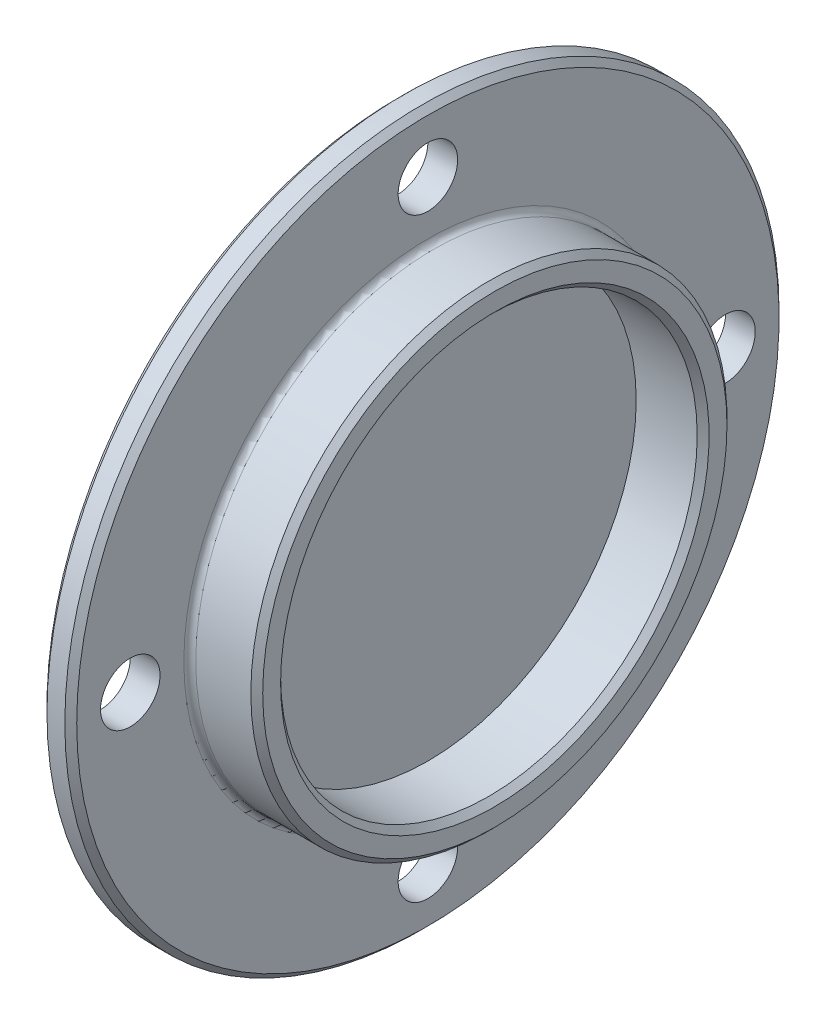
ISO-10303-21;
HEADER;
FILE_DESCRIPTION(('STEP AP214'),'2;1');
FILE_NAME('part.step','',(''),(''),'','','');
FILE_SCHEMA(('AUTOMOTIVE_DESIGN { 1 0 10303 214 1 1 1 1 }'));
ENDSEC;
DATA;
#1=APPLICATION_CONTEXT('core data for automotive mechanical design processes');
#2=APPLICATION_PROTOCOL_DEFINITION('international standard','automotive_design',2000,#1);
#3=PRODUCT_CONTEXT('',#1,'mechanical');
#4=PRODUCT('Part','Part','',(#3));
#5=PRODUCT_RELATED_PRODUCT_CATEGORY('part','',(#4));
#6=PRODUCT_DEFINITION_FORMATION('','',#4);
#7=PRODUCT_DEFINITION_CONTEXT('part definition',#1,'design');
#8=PRODUCT_DEFINITION('design','',#6,#7);
#9=PRODUCT_DEFINITION_SHAPE('','',#8);
#10=(LENGTH_UNIT() NAMED_UNIT(*) SI_UNIT(.MILLI.,.METRE.));
#11=(NAMED_UNIT(*) PLANE_ANGLE_UNIT() SI_UNIT($,.RADIAN.));
#12=(NAMED_UNIT(*) SI_UNIT($,.STERADIAN.) SOLID_ANGLE_UNIT());
#13=UNCERTAINTY_MEASURE_WITH_UNIT(LENGTH_MEASURE(1.E-05),#10,'distance_accuracy_value','');
#14=(GEOMETRIC_REPRESENTATION_CONTEXT(3) GLOBAL_UNCERTAINTY_ASSIGNED_CONTEXT((#13)) GLOBAL_UNIT_ASSIGNED_CONTEXT((#10,
#11,#12)) REPRESENTATION_CONTEXT('',''));
#15=CARTESIAN_POINT('',(0.,0.,0.));
#16=DIRECTION('',(0.,0.,1.));
#17=DIRECTION('',(1.,0.,0.));
#18=AXIS2_PLACEMENT_3D('',#15,#16,#17);
#19=CARTESIAN_POINT('',(0.,120.,0.));
#20=DIRECTION('',(1.,0.,0.));
#21=DIRECTION('',(0.,0.,-1.));
#22=AXIS2_PLACEMENT_3D('',#19,#20,#21);
#23=PLANE('',#22);
#24=CARTESIAN_POINT('',(0.,0.,0.));
#25=DIRECTION('',(1.,0.,0.));
#26=DIRECTION('',(0.,0.,-1.));
#27=AXIS2_PLACEMENT_3D('',#24,#25,#26);
#28=CIRCLE('',#27,118.);
#29=CARTESIAN_POINT('',(0.,0.,-118.));
#30=VERTEX_POINT('',#29);
#31=EDGE_CURVE('E80',#30,#30,#28,.F.);
#32=ORIENTED_EDGE('',*,*,#31,.T.);
#33=EDGE_LOOP('',(#32));
#34=FACE_BOUND('',#33,.T.);
#35=CARTESIAN_POINT('',(0.,0.,-100.));
#36=DIRECTION('',(1.,0.,0.));
#37=DIRECTION('',(0.,0.,-1.));
#38=AXIS2_PLACEMENT_3D('',#35,#36,#37);
#39=CIRCLE('',#38,9.99999999999999);
#40=CARTESIAN_POINT('',(0.,0.,-110.));
#41=VERTEX_POINT('',#40);
#42=EDGE_CURVE('E109',#41,#41,#39,.T.);
#43=ORIENTED_EDGE('',*,*,#42,.T.);
#44=EDGE_LOOP('',(#43));
#45=FACE_BOUND('',#44,.T.);
#46=CARTESIAN_POINT('',(0.,-100.,3.49148133884313E-13));
#47=DIRECTION('',(1.,0.,0.));
#48=DIRECTION('',(0.,0.,-1.));
#49=AXIS2_PLACEMENT_3D('',#46,#47,#48);
#50=CIRCLE('',#49,10.);
#51=CARTESIAN_POINT('',(0.,-100.,-9.99999999999965));
#52=VERTEX_POINT('',#51);
#53=EDGE_CURVE('E121',#52,#52,#50,.T.);
#54=ORIENTED_EDGE('',*,*,#53,.T.);
#55=EDGE_LOOP('',(#54));
#56=FACE_BOUND('',#55,.T.);
#57=CARTESIAN_POINT('',(0.,6.98296267768627E-13,100.));
#58=DIRECTION('',(1.,0.,0.));
#59=DIRECTION('',(0.,0.,-1.));
#60=AXIS2_PLACEMENT_3D('',#57,#58,#59);
#61=CIRCLE('',#60,9.99999999999999);
#62=CARTESIAN_POINT('',(0.,6.98296267768627E-13,90.));
#63=VERTEX_POINT('',#62);
#64=EDGE_CURVE('E117',#63,#63,#61,.T.);
#65=ORIENTED_EDGE('',*,*,#64,.T.);
#66=EDGE_LOOP('',(#65));
#67=FACE_BOUND('',#66,.T.);
#68=CARTESIAN_POINT('',(0.,100.,-1.04744440165294E-12));
#69=DIRECTION('',(1.,0.,0.));
#70=DIRECTION('',(0.,0.,-1.));
#71=AXIS2_PLACEMENT_3D('',#68,#69,#70);
#72=CIRCLE('',#71,9.99999999999999);
#73=CARTESIAN_POINT('',(0.,100.,-10.000000000001));
#74=VERTEX_POINT('',#73);
#75=EDGE_CURVE('E113',#74,#74,#72,.T.);
#76=ORIENTED_EDGE('',*,*,#75,.T.);
#77=EDGE_LOOP('',(#76));
#78=FACE_BOUND('',#77,.T.);
#79=ADVANCED_FACE('F43',(#34,#45,#56,#67,#78),#23,.F.);
#80=CARTESIAN_POINT('',(10.,0.,0.));
#81=DIRECTION('',(-1.,0.,0.));
#82=DIRECTION('',(0.,0.,1.));
#83=AXIS2_PLACEMENT_3D('',#80,#81,#82);
#84=PLANE('',#83);
#85=CARTESIAN_POINT('',(10.,0.,0.));
#86=DIRECTION('',(-1.,0.,0.));
#87=DIRECTION('',(0.,0.,1.));
#88=AXIS2_PLACEMENT_3D('',#85,#86,#87);
#89=CIRCLE('',#88,70.);
#90=CARTESIAN_POINT('',(10.,0.,70.));
#91=VERTEX_POINT('',#90);
#92=EDGE_CURVE('E92',#91,#91,#89,.T.);
#93=ORIENTED_EDGE('',*,*,#92,.F.);
#94=EDGE_LOOP('',(#93));
#95=FACE_BOUND('',#94,.T.);
#96=ADVANCED_FACE('F167',(#95),#84,.F.);
#97=CARTESIAN_POINT('',(-39.7802197802198,0.,0.));
#98=DIRECTION('',(-1.,0.,0.));
#99=DIRECTION('',(0.,0.,1.));
#100=AXIS2_PLACEMENT_3D('',#97,#98,#99);
#101=CYLINDRICAL_SURFACE('',#100,70.);
#102=CARTESIAN_POINT('',(30.5,0.,0.));
#103=DIRECTION('',(-1.,0.,0.));
#104=DIRECTION('',(0.,0.,1.));
#105=AXIS2_PLACEMENT_3D('',#102,#103,#104);
#106=CIRCLE('',#105,70.);
#107=CARTESIAN_POINT('',(30.5,0.,70.));
#108=VERTEX_POINT('',#107);
#109=EDGE_CURVE('E52',#108,#108,#106,.F.);
#110=ORIENTED_EDGE('',*,*,#109,.T.);
#111=EDGE_LOOP('',(#110));
#112=FACE_BOUND('',#111,.T.);
#113=ORIENTED_EDGE('',*,*,#92,.T.);
#114=EDGE_LOOP('',(#113));
#115=FACE_BOUND('',#114,.T.);
#116=ADVANCED_FACE('F173',(#112,#115),#101,.F.);
#117=CARTESIAN_POINT('',(32.5,70.,0.));
#118=DIRECTION('',(-1.,0.,0.));
#119=DIRECTION('',(0.,0.,1.));
#120=AXIS2_PLACEMENT_3D('',#117,#118,#119);
#121=PLANE('',#120);
#122=CARTESIAN_POINT('',(32.5,0.,0.));
#123=DIRECTION('',(-1.,0.,0.));
#124=DIRECTION('',(0.,0.,1.));
#125=AXIS2_PLACEMENT_3D('',#122,#123,#124);
#126=CIRCLE('',#125,72.);
#127=CARTESIAN_POINT('',(32.5,0.,72.));
#128=VERTEX_POINT('',#127);
#129=EDGE_CURVE('E57',#128,#128,#126,.T.);
#130=ORIENTED_EDGE('',*,*,#129,.T.);
#131=EDGE_LOOP('',(#130));
#132=FACE_BOUND('',#131,.T.);
#133=CARTESIAN_POINT('',(32.5,0.,0.));
#134=DIRECTION('',(-1.,0.,0.));
#135=DIRECTION('',(0.,0.,1.));
#136=AXIS2_PLACEMENT_3D('',#133,#134,#135);
#137=CIRCLE('',#136,78.);
#138=CARTESIAN_POINT('',(32.5,0.,78.));
#139=VERTEX_POINT('',#138);
#140=EDGE_CURVE('E62',#139,#139,#137,.F.);
#141=ORIENTED_EDGE('',*,*,#140,.T.);
#142=EDGE_LOOP('',(#141));
#143=FACE_BOUND('',#142,.T.);
#144=ADVANCED_FACE('F207',(#132,#143),#121,.F.);
#145=CARTESIAN_POINT('',(-39.7802197802198,0.,0.));
#146=DIRECTION('',(-1.,0.,0.));
#147=DIRECTION('',(0.,0.,1.));
#148=AXIS2_PLACEMENT_3D('',#145,#146,#147);
#149=CYLINDRICAL_SURFACE('',#148,80.);
#150=CARTESIAN_POINT('',(30.5,0.,0.));
#151=DIRECTION('',(-1.,0.,0.));
#152=DIRECTION('',(0.,0.,1.));
#153=AXIS2_PLACEMENT_3D('',#150,#151,#152);
#154=CIRCLE('',#153,80.);
#155=CARTESIAN_POINT('',(30.5,0.,80.));
#156=VERTEX_POINT('',#155);
#157=EDGE_CURVE('E10',#156,#156,#154,.T.);
#158=ORIENTED_EDGE('',*,*,#157,.T.);
#159=EDGE_LOOP('',(#158));
#160=FACE_BOUND('',#159,.T.);
#161=CARTESIAN_POINT('',(12.,0.,0.));
#162=DIRECTION('',(-1.,0.,0.));
#163=DIRECTION('',(0.,0.,1.));
#164=AXIS2_PLACEMENT_3D('',#161,#162,#163);
#165=CIRCLE('',#164,80.);
#166=CARTESIAN_POINT('',(12.,0.,80.));
#167=VERTEX_POINT('',#166);
#168=EDGE_CURVE('E84',#167,#167,#165,.F.);
#169=ORIENTED_EDGE('',*,*,#168,.T.);
#170=EDGE_LOOP('',(#169));
#171=FACE_BOUND('',#170,.T.);
#172=ADVANCED_FACE('F143',(#160,#171),#149,.T.);
#173=CARTESIAN_POINT('',(9.99999999999999,80.,0.));
#174=DIRECTION('',(-1.,0.,0.));
#175=DIRECTION('',(0.,0.,1.));
#176=AXIS2_PLACEMENT_3D('',#173,#174,#175);
#177=PLANE('',#176);
#178=CARTESIAN_POINT('',(9.99999999999999,0.,0.));
#179=DIRECTION('',(-1.,0.,0.));
#180=DIRECTION('',(0.,0.,1.));
#181=AXIS2_PLACEMENT_3D('',#178,#179,#180);
#182=CIRCLE('',#181,118.);
#183=CARTESIAN_POINT('',(9.99999999999999,0.,118.));
#184=VERTEX_POINT('',#183);
#185=EDGE_CURVE('E68',#184,#184,#182,.F.);
#186=ORIENTED_EDGE('',*,*,#185,.T.);
#187=EDGE_LOOP('',(#186));
#188=FACE_BOUND('',#187,.T.);
#189=CARTESIAN_POINT('',(9.99999999999999,0.,0.));
#190=DIRECTION('',(-1.,0.,0.));
#191=DIRECTION('',(0.,0.,1.));
#192=AXIS2_PLACEMENT_3D('',#189,#190,#191);
#193=CIRCLE('',#192,82.);
#194=CARTESIAN_POINT('',(9.99999999999999,0.,82.));
#195=VERTEX_POINT('',#194);
#196=EDGE_CURVE('E88',#195,#195,#193,.T.);
#197=ORIENTED_EDGE('',*,*,#196,.T.);
#198=EDGE_LOOP('',(#197));
#199=FACE_BOUND('',#198,.T.);
#200=CARTESIAN_POINT('',(9.99999999999999,0.,-100.));
#201=DIRECTION('',(-1.,0.,0.));
#202=DIRECTION('',(0.,0.,1.));
#203=AXIS2_PLACEMENT_3D('',#200,#201,#202);
#204=CIRCLE('',#203,9.99999999999999);
#205=CARTESIAN_POINT('',(9.99999999999999,0.,-90.));
#206=VERTEX_POINT('',#205);
#207=EDGE_CURVE('E93',#206,#206,#204,.F.);
#208=ORIENTED_EDGE('',*,*,#207,.F.);
#209=EDGE_LOOP('',(#208));
#210=FACE_BOUND('',#209,.T.);
#211=CARTESIAN_POINT('',(9.99999999999999,-100.,3.49148133884313E-13));
#212=DIRECTION('',(-1.,0.,0.));
#213=DIRECTION('',(0.,0.,1.));
#214=AXIS2_PLACEMENT_3D('',#211,#212,#213);
#215=CIRCLE('',#214,10.);
#216=CARTESIAN_POINT('',(9.99999999999999,-100.,10.0000000000003));
#217=VERTEX_POINT('',#216);
#218=EDGE_CURVE('E97',#217,#217,#215,.F.);
#219=ORIENTED_EDGE('',*,*,#218,.F.);
#220=EDGE_LOOP('',(#219));
#221=FACE_BOUND('',#220,.T.);
#222=CARTESIAN_POINT('',(9.99999999999999,6.98296267768627E-13,100.));
#223=DIRECTION('',(-1.,0.,0.));
#224=DIRECTION('',(0.,0.,1.));
#225=AXIS2_PLACEMENT_3D('',#222,#223,#224);
#226=CIRCLE('',#225,9.99999999999999);
#227=CARTESIAN_POINT('',(9.99999999999999,6.98296267768627E-13,110.));
#228=VERTEX_POINT('',#227);
#229=EDGE_CURVE('E101',#228,#228,#226,.F.);
#230=ORIENTED_EDGE('',*,*,#229,.F.);
#231=EDGE_LOOP('',(#230));
#232=FACE_BOUND('',#231,.T.);
#233=CARTESIAN_POINT('',(9.99999999999999,100.,-1.04744440165294E-12));
#234=DIRECTION('',(-1.,0.,0.));
#235=DIRECTION('',(0.,0.,1.));
#236=AXIS2_PLACEMENT_3D('',#233,#234,#235);
#237=CIRCLE('',#236,9.99999999999999);
#238=CARTESIAN_POINT('',(9.99999999999999,100.,9.99999999999894));
#239=VERTEX_POINT('',#238);
#240=EDGE_CURVE('E105',#239,#239,#237,.F.);
#241=ORIENTED_EDGE('',*,*,#240,.F.);
#242=EDGE_LOOP('',(#241));
#243=FACE_BOUND('',#242,.T.);
#244=ADVANCED_FACE('F139',(#188,#199,#210,#221,#232,#243),#177,.F.);
#245=CARTESIAN_POINT('',(-39.7802197802198,0.,0.));
#246=DIRECTION('',(-1.,0.,0.));
#247=DIRECTION('',(0.,0.,1.));
#248=AXIS2_PLACEMENT_3D('',#245,#246,#247);
#249=CYLINDRICAL_SURFACE('',#248,120.);
#250=CARTESIAN_POINT('',(2.00000000000011,0.,0.));
#251=DIRECTION('',(1.,0.,0.));
#252=DIRECTION('',(0.,0.,-1.));
#253=AXIS2_PLACEMENT_3D('',#250,#251,#252);
#254=CIRCLE('',#253,120.);
#255=CARTESIAN_POINT('',(2.00000000000011,0.,-120.));
#256=VERTEX_POINT('',#255);
#257=EDGE_CURVE('E72',#256,#256,#254,.T.);
#258=ORIENTED_EDGE('',*,*,#257,.T.);
#259=EDGE_LOOP('',(#258));
#260=FACE_BOUND('',#259,.T.);
#261=CARTESIAN_POINT('',(7.99999999999998,0.,0.));
#262=DIRECTION('',(-1.,0.,0.));
#263=DIRECTION('',(0.,0.,1.));
#264=AXIS2_PLACEMENT_3D('',#261,#262,#263);
#265=CIRCLE('',#264,120.);
#266=CARTESIAN_POINT('',(7.99999999999998,0.,120.));
#267=VERTEX_POINT('',#266);
#268=EDGE_CURVE('E76',#267,#267,#265,.T.);
#269=ORIENTED_EDGE('',*,*,#268,.T.);
#270=EDGE_LOOP('',(#269));
#271=FACE_BOUND('',#270,.T.);
#272=ADVANCED_FACE('F142',(#260,#271),#249,.T.);
#273=CARTESIAN_POINT('',(32.5,100.,-1.04744440165294E-12));
#274=DIRECTION('',(-1.,0.,0.));
#275=DIRECTION('',(0.,0.,1.));
#276=AXIS2_PLACEMENT_3D('',#273,#274,#275);
#277=CYLINDRICAL_SURFACE('',#276,9.99999999999999);
#278=ORIENTED_EDGE('',*,*,#75,.F.);
#279=EDGE_LOOP('',(#278));
#280=FACE_BOUND('',#279,.T.);
#281=ORIENTED_EDGE('',*,*,#240,.T.);
#282=EDGE_LOOP('',(#281));
#283=FACE_BOUND('',#282,.T.);
#284=ADVANCED_FACE('F152',(#280,#283),#277,.F.);
#285=CARTESIAN_POINT('',(32.5,6.98296267768627E-13,100.));
#286=DIRECTION('',(-1.,0.,0.));
#287=DIRECTION('',(0.,0.,1.));
#288=AXIS2_PLACEMENT_3D('',#285,#286,#287);
#289=CYLINDRICAL_SURFACE('',#288,9.99999999999999);
#290=ORIENTED_EDGE('',*,*,#64,.F.);
#291=EDGE_LOOP('',(#290));
#292=FACE_BOUND('',#291,.T.);
#293=ORIENTED_EDGE('',*,*,#229,.T.);
#294=EDGE_LOOP('',(#293));
#295=FACE_BOUND('',#294,.T.);
#296=ADVANCED_FACE('F154',(#292,#295),#289,.F.);
#297=CARTESIAN_POINT('',(32.5,-100.,3.49148133884313E-13));
#298=DIRECTION('',(-1.,0.,0.));
#299=DIRECTION('',(0.,0.,1.));
#300=AXIS2_PLACEMENT_3D('',#297,#298,#299);
#301=CYLINDRICAL_SURFACE('',#300,10.);
#302=ORIENTED_EDGE('',*,*,#53,.F.);
#303=EDGE_LOOP('',(#302));
#304=FACE_BOUND('',#303,.T.);
#305=ORIENTED_EDGE('',*,*,#218,.T.);
#306=EDGE_LOOP('',(#305));
#307=FACE_BOUND('',#306,.T.);
#308=ADVANCED_FACE('F135',(#304,#307),#301,.F.);
#309=CARTESIAN_POINT('',(32.5,0.,-100.));
#310=DIRECTION('',(-1.,0.,0.));
#311=DIRECTION('',(0.,0.,1.));
#312=AXIS2_PLACEMENT_3D('',#309,#310,#311);
#313=CYLINDRICAL_SURFACE('',#312,9.99999999999999);
#314=ORIENTED_EDGE('',*,*,#42,.F.);
#315=EDGE_LOOP('',(#314));
#316=FACE_BOUND('',#315,.T.);
#317=ORIENTED_EDGE('',*,*,#207,.T.);
#318=EDGE_LOOP('',(#317));
#319=FACE_BOUND('',#318,.T.);
#320=ADVANCED_FACE('F131',(#316,#319),#313,.F.);
#321=CARTESIAN_POINT('',(12.,0.,0.));
#322=DIRECTION('',(-1.,0.,0.));
#323=DIRECTION('',(0.,0.,1.));
#324=AXIS2_PLACEMENT_3D('',#321,#322,#323);
#325=TOROIDAL_SURFACE('',#324,82.,2.);
#326=ORIENTED_EDGE('',*,*,#168,.F.);
#327=EDGE_LOOP('',(#326));
#328=FACE_BOUND('',#327,.T.);
#329=ORIENTED_EDGE('',*,*,#196,.F.);
#330=EDGE_LOOP('',(#329));
#331=FACE_BOUND('',#330,.T.);
#332=ADVANCED_FACE('F134',(#328,#331),#325,.F.);
#333=CARTESIAN_POINT('',(0.,0.,0.));
#334=DIRECTION('',(1.,0.,0.));
#335=DIRECTION('',(0.,0.,-1.));
#336=AXIS2_PLACEMENT_3D('',#333,#334,#335);
#337=CONICAL_SURFACE('',#336,118.,0.785398163397448);
#338=ORIENTED_EDGE('',*,*,#257,.F.);
#339=EDGE_LOOP('',(#338));
#340=FACE_BOUND('',#339,.T.);
#341=ORIENTED_EDGE('',*,*,#31,.F.);
#342=EDGE_LOOP('',(#341));
#343=FACE_BOUND('',#342,.T.);
#344=ADVANCED_FACE('F180',(#340,#343),#337,.T.);
#345=CARTESIAN_POINT('',(7.99999999999998,0.,0.));
#346=DIRECTION('',(-1.,0.,0.));
#347=DIRECTION('',(0.,0.,1.));
#348=AXIS2_PLACEMENT_3D('',#345,#346,#347);
#349=CONICAL_SURFACE('',#348,120.,0.785398163397448);
#350=ORIENTED_EDGE('',*,*,#185,.F.);
#351=EDGE_LOOP('',(#350));
#352=FACE_BOUND('',#351,.T.);
#353=ORIENTED_EDGE('',*,*,#268,.F.);
#354=EDGE_LOOP('',(#353));
#355=FACE_BOUND('',#354,.T.);
#356=ADVANCED_FACE('F188',(#352,#355),#349,.T.);
#357=CARTESIAN_POINT('',(32.5,0.,0.));
#358=DIRECTION('',(1.,0.,0.));
#359=DIRECTION('',(0.,0.,-1.));
#360=AXIS2_PLACEMENT_3D('',#357,#358,#359);
#361=CONICAL_SURFACE('',#360,72.,0.785398163397441);
#362=ORIENTED_EDGE('',*,*,#109,.F.);
#363=EDGE_LOOP('',(#362));
#364=FACE_BOUND('',#363,.T.);
#365=ORIENTED_EDGE('',*,*,#129,.F.);
#366=EDGE_LOOP('',(#365));
#367=FACE_BOUND('',#366,.T.);
#368=ADVANCED_FACE('F194',(#364,#367),#361,.F.);
#369=CARTESIAN_POINT('',(30.5,0.,0.));
#370=DIRECTION('',(-1.,0.,0.));
#371=DIRECTION('',(0.,0.,1.));
#372=AXIS2_PLACEMENT_3D('',#369,#370,#371);
#373=CONICAL_SURFACE('',#372,80.,0.785398163397452);
#374=ORIENTED_EDGE('',*,*,#140,.F.);
#375=EDGE_LOOP('',(#374));
#376=FACE_BOUND('',#375,.T.);
#377=ORIENTED_EDGE('',*,*,#157,.F.);
#378=EDGE_LOOP('',(#377));
#379=FACE_BOUND('',#378,.T.);
#380=ADVANCED_FACE('F46',(#376,#379),#373,.T.);
#381=CLOSED_SHELL('',(#79,#96,#116,#144,#172,#244,#272,#284,#296,#308,#320,#332,#344,#356,#368,#380));
#382=MANIFOLD_SOLID_BREP('B2',#381);
#383=ADVANCED_BREP_SHAPE_REPRESENTATION('',(#18,#382),#14);
#384=SHAPE_DEFINITION_REPRESENTATION(#9,#383);
ENDSEC;
END-ISO-10303-21;
